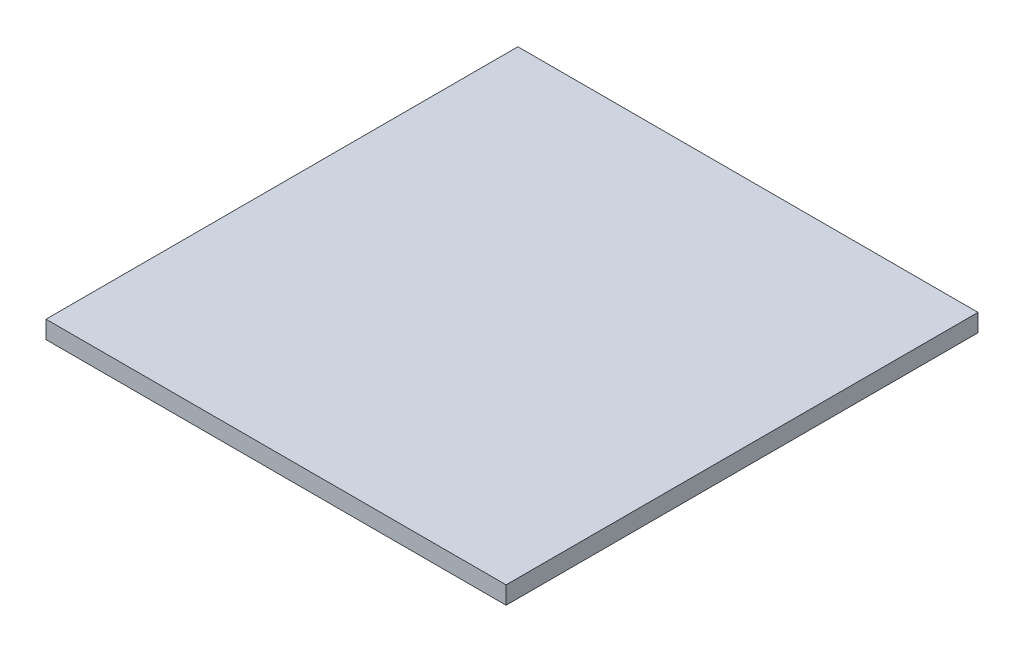
ISO-10303-21;
HEADER;
FILE_DESCRIPTION(('STEP AP214'),'2;1');
FILE_NAME('part.step','',(''),(''),'','','');
FILE_SCHEMA(('AUTOMOTIVE_DESIGN { 1 0 10303 214 1 1 1 1 }'));
ENDSEC;
DATA;
#1=APPLICATION_CONTEXT('core data for automotive mechanical design processes');
#2=APPLICATION_PROTOCOL_DEFINITION('international standard','automotive_design',2000,#1);
#3=PRODUCT_CONTEXT('',#1,'mechanical');
#4=PRODUCT('Part','Part','',(#3));
#5=PRODUCT_RELATED_PRODUCT_CATEGORY('part','',(#4));
#6=PRODUCT_DEFINITION_FORMATION('','',#4);
#7=PRODUCT_DEFINITION_CONTEXT('part definition',#1,'design');
#8=PRODUCT_DEFINITION('design','',#6,#7);
#9=PRODUCT_DEFINITION_SHAPE('','',#8);
#10=(LENGTH_UNIT() NAMED_UNIT(*) SI_UNIT(.MILLI.,.METRE.));
#11=(NAMED_UNIT(*) PLANE_ANGLE_UNIT() SI_UNIT($,.RADIAN.));
#12=(NAMED_UNIT(*) SI_UNIT($,.STERADIAN.) SOLID_ANGLE_UNIT());
#13=UNCERTAINTY_MEASURE_WITH_UNIT(LENGTH_MEASURE(1.E-05),#10,'distance_accuracy_value','');
#14=(GEOMETRIC_REPRESENTATION_CONTEXT(3) GLOBAL_UNCERTAINTY_ASSIGNED_CONTEXT((#13)) GLOBAL_UNIT_ASSIGNED_CONTEXT((#10,
#11,#12)) REPRESENTATION_CONTEXT('',''));
#15=CARTESIAN_POINT('',(0.,0.,0.));
#16=DIRECTION('',(0.,0.,1.));
#17=DIRECTION('',(1.,0.,0.));
#18=AXIS2_PLACEMENT_3D('',#15,#16,#17);
#19=CARTESIAN_POINT('',(247.65,19.05,-254.));
#20=DIRECTION('',(-1.,0.,0.));
#21=DIRECTION('',(0.,0.,1.));
#22=AXIS2_PLACEMENT_3D('',#19,#20,#21);
#23=PLANE('',#22);
#24=DIRECTION('',(0.,0.,-1.));
#25=VECTOR('',#24,1.);
#26=CARTESIAN_POINT('',(247.65,0.,-254.));
#27=LINE('',#26,#25);
#28=CARTESIAN_POINT('',(247.65,0.,254.));
#29=VERTEX_POINT('',#28);
#30=CARTESIAN_POINT('',(247.65,0.,-254.));
#31=VERTEX_POINT('',#30);
#32=EDGE_CURVE('E96',#29,#31,#27,.T.);
#33=ORIENTED_EDGE('',*,*,#32,.T.);
#34=DIRECTION('',(0.,-1.,0.));
#35=VECTOR('',#34,1.);
#36=CARTESIAN_POINT('',(247.65,19.05,-254.));
#37=LINE('',#36,#35);
#38=CARTESIAN_POINT('',(247.65,19.05,-254.));
#39=VERTEX_POINT('',#38);
#40=EDGE_CURVE('E11',#39,#31,#37,.T.);
#41=ORIENTED_EDGE('',*,*,#40,.F.);
#42=DIRECTION('',(0.,0.,-1.));
#43=VECTOR('',#42,1.);
#44=CARTESIAN_POINT('',(247.65,19.05,-254.));
#45=LINE('',#44,#43);
#46=CARTESIAN_POINT('',(247.65,19.05,254.));
#47=VERTEX_POINT('',#46);
#48=EDGE_CURVE('E84',#47,#39,#45,.T.);
#49=ORIENTED_EDGE('',*,*,#48,.F.);
#50=DIRECTION('',(0.,-1.,0.));
#51=VECTOR('',#50,1.);
#52=CARTESIAN_POINT('',(247.65,19.05,254.));
#53=LINE('',#52,#51);
#54=EDGE_CURVE('E92',#47,#29,#53,.T.);
#55=ORIENTED_EDGE('',*,*,#54,.T.);
#56=EDGE_LOOP('',(#33,#41,#49,#55));
#57=FACE_BOUND('',#56,.T.);
#58=ADVANCED_FACE('F33',(#57),#23,.F.);
#59=CARTESIAN_POINT('',(-247.65,19.05,-254.));
#60=DIRECTION('',(0.,0.,1.));
#61=DIRECTION('',(1.,0.,0.));
#62=AXIS2_PLACEMENT_3D('',#59,#60,#61);
#63=PLANE('',#62);
#64=DIRECTION('',(-1.,0.,0.));
#65=VECTOR('',#64,1.);
#66=CARTESIAN_POINT('',(-247.65,0.,-254.));
#67=LINE('',#66,#65);
#68=CARTESIAN_POINT('',(-247.65,0.,-254.));
#69=VERTEX_POINT('',#68);
#70=EDGE_CURVE('E88',#31,#69,#67,.T.);
#71=ORIENTED_EDGE('',*,*,#70,.T.);
#72=DIRECTION('',(0.,-1.,0.));
#73=VECTOR('',#72,1.);
#74=CARTESIAN_POINT('',(-247.65,19.05,-254.));
#75=LINE('',#74,#73);
#76=CARTESIAN_POINT('',(-247.65,19.05,-254.));
#77=VERTEX_POINT('',#76);
#78=EDGE_CURVE('E41',#77,#69,#75,.T.);
#79=ORIENTED_EDGE('',*,*,#78,.F.);
#80=DIRECTION('',(-1.,0.,0.));
#81=VECTOR('',#80,1.);
#82=CARTESIAN_POINT('',(-247.65,19.05,-254.));
#83=LINE('',#82,#81);
#84=EDGE_CURVE('E79',#39,#77,#83,.T.);
#85=ORIENTED_EDGE('',*,*,#84,.F.);
#86=ORIENTED_EDGE('',*,*,#40,.T.);
#87=EDGE_LOOP('',(#71,#79,#85,#86));
#88=FACE_BOUND('',#87,.T.);
#89=ADVANCED_FACE('F87',(#88),#63,.F.);
#90=CARTESIAN_POINT('',(-247.65,19.05,-254.));
#91=DIRECTION('',(1.,0.,0.));
#92=DIRECTION('',(0.,0.,-1.));
#93=AXIS2_PLACEMENT_3D('',#90,#91,#92);
#94=PLANE('',#93);
#95=DIRECTION('',(0.,0.,1.));
#96=VECTOR('',#95,1.);
#97=CARTESIAN_POINT('',(-247.65,0.,-254.));
#98=LINE('',#97,#96);
#99=CARTESIAN_POINT('',(-247.65,0.,254.));
#100=VERTEX_POINT('',#99);
#101=EDGE_CURVE('E66',#69,#100,#98,.T.);
#102=ORIENTED_EDGE('',*,*,#101,.T.);
#103=DIRECTION('',(0.,-1.,0.));
#104=VECTOR('',#103,1.);
#105=CARTESIAN_POINT('',(-247.65,19.05,254.));
#106=LINE('',#105,#104);
#107=CARTESIAN_POINT('',(-247.65,19.05,254.));
#108=VERTEX_POINT('',#107);
#109=EDGE_CURVE('E89',#108,#100,#106,.T.);
#110=ORIENTED_EDGE('',*,*,#109,.F.);
#111=DIRECTION('',(0.,0.,1.));
#112=VECTOR('',#111,1.);
#113=CARTESIAN_POINT('',(-247.65,19.05,-254.));
#114=LINE('',#113,#112);
#115=EDGE_CURVE('E82',#77,#108,#114,.T.);
#116=ORIENTED_EDGE('',*,*,#115,.F.);
#117=ORIENTED_EDGE('',*,*,#78,.T.);
#118=EDGE_LOOP('',(#102,#110,#116,#117));
#119=FACE_BOUND('',#118,.T.);
#120=ADVANCED_FACE('F90',(#119),#94,.F.);
#121=CARTESIAN_POINT('',(-247.65,19.05,254.));
#122=DIRECTION('',(0.,0.,-1.));
#123=DIRECTION('',(-1.,0.,0.));
#124=AXIS2_PLACEMENT_3D('',#121,#122,#123);
#125=PLANE('',#124);
#126=DIRECTION('',(1.,0.,0.));
#127=VECTOR('',#126,1.);
#128=CARTESIAN_POINT('',(-247.65,0.,254.));
#129=LINE('',#128,#127);
#130=EDGE_CURVE('E72',#100,#29,#129,.T.);
#131=ORIENTED_EDGE('',*,*,#130,.T.);
#132=ORIENTED_EDGE('',*,*,#54,.F.);
#133=DIRECTION('',(1.,0.,0.));
#134=VECTOR('',#133,1.);
#135=CARTESIAN_POINT('',(-247.65,19.05,254.));
#136=LINE('',#135,#134);
#137=EDGE_CURVE('E49',#108,#47,#136,.T.);
#138=ORIENTED_EDGE('',*,*,#137,.F.);
#139=ORIENTED_EDGE('',*,*,#109,.T.);
#140=EDGE_LOOP('',(#131,#132,#138,#139));
#141=FACE_BOUND('',#140,.T.);
#142=ADVANCED_FACE('F103',(#141),#125,.F.);
#143=CARTESIAN_POINT('',(0.,19.05,0.));
#144=DIRECTION('',(0.,1.,0.));
#145=DIRECTION('',(0.,0.,1.));
#146=AXIS2_PLACEMENT_3D('',#143,#144,#145);
#147=PLANE('',#146);
#148=ORIENTED_EDGE('',*,*,#48,.T.);
#149=ORIENTED_EDGE('',*,*,#84,.T.);
#150=ORIENTED_EDGE('',*,*,#115,.T.);
#151=ORIENTED_EDGE('',*,*,#137,.T.);
#152=EDGE_LOOP('',(#148,#149,#150,#151));
#153=FACE_BOUND('',#152,.T.);
#154=ADVANCED_FACE('F80',(#153),#147,.T.);
#155=CARTESIAN_POINT('',(0.,0.,0.));
#156=DIRECTION('',(0.,1.,0.));
#157=DIRECTION('',(0.,0.,1.));
#158=AXIS2_PLACEMENT_3D('',#155,#156,#157);
#159=PLANE('',#158);
#160=ORIENTED_EDGE('',*,*,#32,.F.);
#161=ORIENTED_EDGE('',*,*,#130,.F.);
#162=ORIENTED_EDGE('',*,*,#101,.F.);
#163=ORIENTED_EDGE('',*,*,#70,.F.);
#164=EDGE_LOOP('',(#160,#161,#162,#163));
#165=FACE_BOUND('',#164,.T.);
#166=ADVANCED_FACE('F106',(#165),#159,.F.);
#167=CLOSED_SHELL('',(#58,#89,#120,#142,#154,#166));
#168=MANIFOLD_SOLID_BREP('B2',#167);
#169=ADVANCED_BREP_SHAPE_REPRESENTATION('',(#18,#168),#14);
#170=SHAPE_DEFINITION_REPRESENTATION(#9,#169);
ENDSEC;
END-ISO-10303-21;
